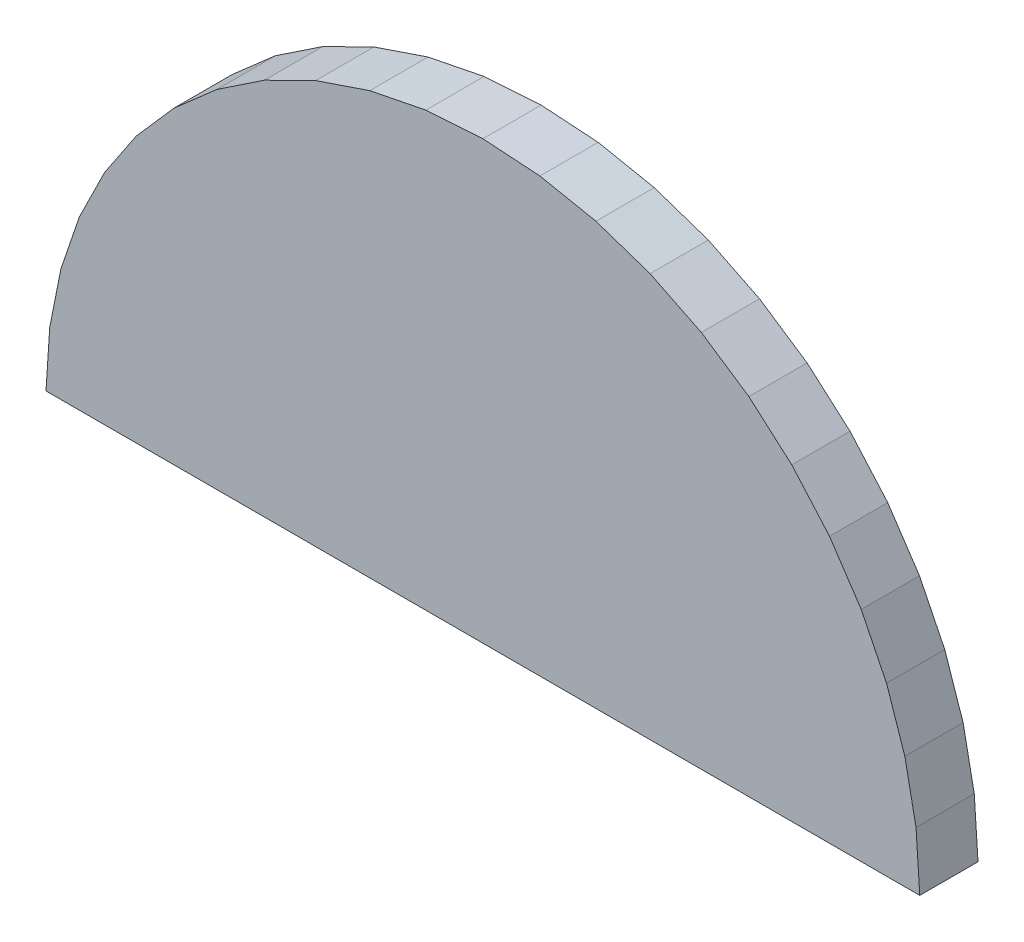
ISO-10303-21;
HEADER;
FILE_DESCRIPTION(('STEP AP214'),'2;1');
FILE_NAME('part.step','',(''),(''),'','','');
FILE_SCHEMA(('AUTOMOTIVE_DESIGN { 1 0 10303 214 1 1 1 1 }'));
ENDSEC;
DATA;
#1=APPLICATION_CONTEXT('core data for automotive mechanical design processes');
#2=APPLICATION_PROTOCOL_DEFINITION('international standard','automotive_design',2000,#1);
#3=PRODUCT_CONTEXT('',#1,'mechanical');
#4=PRODUCT('Part','Part','',(#3));
#5=PRODUCT_RELATED_PRODUCT_CATEGORY('part','',(#4));
#6=PRODUCT_DEFINITION_FORMATION('','',#4);
#7=PRODUCT_DEFINITION_CONTEXT('part definition',#1,'design');
#8=PRODUCT_DEFINITION('design','',#6,#7);
#9=PRODUCT_DEFINITION_SHAPE('','',#8);
#10=(LENGTH_UNIT() NAMED_UNIT(*) SI_UNIT(.MILLI.,.METRE.));
#11=(NAMED_UNIT(*) PLANE_ANGLE_UNIT() SI_UNIT($,.RADIAN.));
#12=(NAMED_UNIT(*) SI_UNIT($,.STERADIAN.) SOLID_ANGLE_UNIT());
#13=UNCERTAINTY_MEASURE_WITH_UNIT(LENGTH_MEASURE(1.E-05),#10,'distance_accuracy_value','');
#14=(GEOMETRIC_REPRESENTATION_CONTEXT(3) GLOBAL_UNCERTAINTY_ASSIGNED_CONTEXT((#13)) GLOBAL_UNIT_ASSIGNED_CONTEXT((#10,
#11,#12)) REPRESENTATION_CONTEXT('',''));
#15=CARTESIAN_POINT('',(0.,0.,0.));
#16=DIRECTION('',(0.,0.,1.));
#17=DIRECTION('',(1.,0.,0.));
#18=AXIS2_PLACEMENT_3D('',#15,#16,#17);
#19=CARTESIAN_POINT('',(-90.,0.,12.));
#20=DIRECTION('',(0.,1.,0.));
#21=DIRECTION('',(-1.,0.,0.));
#22=AXIS2_PLACEMENT_3D('',#19,#20,#21);
#23=PLANE('',#22);
#24=DIRECTION('',(1.,0.,0.));
#25=VECTOR('',#24,1.);
#26=CARTESIAN_POINT('',(-90.,0.,0.));
#27=LINE('',#26,#25);
#28=CARTESIAN_POINT('',(-90.,0.,0.));
#29=VERTEX_POINT('',#28);
#30=CARTESIAN_POINT('',(90.,0.,0.));
#31=VERTEX_POINT('',#30);
#32=EDGE_CURVE('E237',#29,#31,#27,.T.);
#33=ORIENTED_EDGE('',*,*,#32,.T.);
#34=DIRECTION('',(0.,0.,-1.));
#35=VECTOR('',#34,1.);
#36=CARTESIAN_POINT('',(90.,0.,12.));
#37=LINE('',#36,#35);
#38=CARTESIAN_POINT('',(90.,0.,12.));
#39=VERTEX_POINT('',#38);
#40=EDGE_CURVE('E11',#39,#31,#37,.T.);
#41=ORIENTED_EDGE('',*,*,#40,.F.);
#42=DIRECTION('',(1.,0.,0.));
#43=VECTOR('',#42,1.);
#44=CARTESIAN_POINT('',(-90.,0.,12.));
#45=LINE('',#44,#43);
#46=CARTESIAN_POINT('',(-90.,0.,12.));
#47=VERTEX_POINT('',#46);
#48=EDGE_CURVE('E285',#47,#39,#45,.T.);
#49=ORIENTED_EDGE('',*,*,#48,.F.);
#50=DIRECTION('',(0.,0.,-1.));
#51=VECTOR('',#50,1.);
#52=CARTESIAN_POINT('',(-90.,0.,12.));
#53=LINE('',#52,#51);
#54=EDGE_CURVE('E233',#47,#29,#53,.T.);
#55=ORIENTED_EDGE('',*,*,#54,.T.);
#56=EDGE_LOOP('',(#33,#41,#49,#55));
#57=FACE_BOUND('',#56,.T.);
#58=ADVANCED_FACE('F39',(#57),#23,.F.);
#59=CARTESIAN_POINT('',(90.,0.,12.));
#60=DIRECTION('',(-0.997858923238603,-0.0654031292301432,0.));
#61=DIRECTION('',(0.0654031292301432,-0.997858923238604,0.));
#62=AXIS2_PLACEMENT_3D('',#59,#60,#61);
#63=PLANE('',#62);
#64=DIRECTION('',(-0.0654031292301432,0.997858923238603,0.));
#65=VECTOR('',#64,1.);
#66=CARTESIAN_POINT('',(90.,0.,0.));
#67=LINE('',#66,#65);
#68=CARTESIAN_POINT('',(89.2300375236429,11.7473572998046,0.));
#69=VERTEX_POINT('',#68);
#70=EDGE_CURVE('E240',#31,#69,#67,.T.);
#71=ORIENTED_EDGE('',*,*,#70,.T.);
#72=DIRECTION('',(0.,0.,-1.));
#73=VECTOR('',#72,1.);
#74=CARTESIAN_POINT('',(89.2300375236429,11.7473572998046,12.));
#75=LINE('',#74,#73);
#76=CARTESIAN_POINT('',(89.2300375236429,11.7473572998046,12.));
#77=VERTEX_POINT('',#76);
#78=EDGE_CURVE('E47',#77,#69,#75,.T.);
#79=ORIENTED_EDGE('',*,*,#78,.F.);
#80=DIRECTION('',(-0.0654031292301432,0.997858923238603,0.));
#81=VECTOR('',#80,1.);
#82=CARTESIAN_POINT('',(90.,0.,12.));
#83=LINE('',#82,#81);
#84=EDGE_CURVE('E149',#39,#77,#83,.T.);
#85=ORIENTED_EDGE('',*,*,#84,.F.);
#86=ORIENTED_EDGE('',*,*,#40,.T.);
#87=EDGE_LOOP('',(#71,#79,#85,#86));
#88=FACE_BOUND('',#87,.T.);
#89=ADVANCED_FACE('F428',(#88),#63,.F.);
#90=CARTESIAN_POINT('',(89.2300375236429,11.7473572998046,12.));
#91=DIRECTION('',(-0.980785280403231,-0.195090322016127,0.));
#92=DIRECTION('',(0.195090322016127,-0.980785280403231,0.));
#93=AXIS2_PLACEMENT_3D('',#90,#91,#92);
#94=PLANE('',#93);
#95=DIRECTION('',(-0.195090322016127,0.980785280403231,0.));
#96=VECTOR('',#95,1.);
#97=CARTESIAN_POINT('',(89.2300375236429,11.7473572998046,0.));
#98=LINE('',#97,#96);
#99=CARTESIAN_POINT('',(86.9333243660162,23.2937140592269,0.));
#100=VERTEX_POINT('',#99);
#101=EDGE_CURVE('E242',#69,#100,#98,.T.);
#102=ORIENTED_EDGE('',*,*,#101,.T.);
#103=DIRECTION('',(0.,0.,-1.));
#104=VECTOR('',#103,1.);
#105=CARTESIAN_POINT('',(86.9333243660162,23.2937140592269,12.));
#106=LINE('',#105,#104);
#107=CARTESIAN_POINT('',(86.9333243660162,23.2937140592269,12.));
#108=VERTEX_POINT('',#107);
#109=EDGE_CURVE('E343',#108,#100,#106,.T.);
#110=ORIENTED_EDGE('',*,*,#109,.F.);
#111=DIRECTION('',(-0.195090322016127,0.980785280403231,0.));
#112=VECTOR('',#111,1.);
#113=CARTESIAN_POINT('',(89.2300375236429,11.7473572998046,12.));
#114=LINE('',#113,#112);
#115=EDGE_CURVE('E351',#77,#108,#114,.T.);
#116=ORIENTED_EDGE('',*,*,#115,.F.);
#117=ORIENTED_EDGE('',*,*,#78,.T.);
#118=EDGE_LOOP('',(#102,#110,#116,#117));
#119=FACE_BOUND('',#118,.T.);
#120=ADVANCED_FACE('F349',(#119),#94,.F.);
#121=CARTESIAN_POINT('',(86.9333243660162,23.2937140592269,12.));
#122=DIRECTION('',(-0.946930129495105,-0.321439465303162,0.));
#123=DIRECTION('',(0.321439465303162,-0.946930129495105,0.));
#124=AXIS2_PLACEMENT_3D('',#121,#122,#123);
#125=PLANE('',#124);
#126=DIRECTION('',(-0.321439465303162,0.946930129495105,0.));
#127=VECTOR('',#126,1.);
#128=CARTESIAN_POINT('',(86.9333243660162,23.2937140592269,0.));
#129=LINE('',#128,#127);
#130=CARTESIAN_POINT('',(83.1491579260158,34.4415089128581,0.));
#131=VERTEX_POINT('',#130);
#132=EDGE_CURVE('E244',#100,#131,#129,.T.);
#133=ORIENTED_EDGE('',*,*,#132,.T.);
#134=DIRECTION('',(0.,0.,-1.));
#135=VECTOR('',#134,1.);
#136=CARTESIAN_POINT('',(83.1491579260158,34.4415089128581,12.));
#137=LINE('',#136,#135);
#138=CARTESIAN_POINT('',(83.1491579260158,34.4415089128581,12.));
#139=VERTEX_POINT('',#138);
#140=EDGE_CURVE('E340',#139,#131,#137,.T.);
#141=ORIENTED_EDGE('',*,*,#140,.F.);
#142=DIRECTION('',(-0.321439465303162,0.946930129495105,0.));
#143=VECTOR('',#142,1.);
#144=CARTESIAN_POINT('',(86.9333243660162,23.2937140592269,12.));
#145=LINE('',#144,#143);
#146=EDGE_CURVE('E369',#108,#139,#145,.T.);
#147=ORIENTED_EDGE('',*,*,#146,.F.);
#148=ORIENTED_EDGE('',*,*,#109,.T.);
#149=EDGE_LOOP('',(#133,#141,#147,#148));
#150=FACE_BOUND('',#149,.T.);
#151=ADVANCED_FACE('F360',(#150),#125,.F.);
#152=CARTESIAN_POINT('',(83.1491579260158,34.4415089128581,12.));
#153=DIRECTION('',(-0.896872741532688,-0.442288690219002,0.));
#154=DIRECTION('',(0.442288690219002,-0.896872741532688,0.));
#155=AXIS2_PLACEMENT_3D('',#152,#153,#154);
#156=PLANE('',#155);
#157=DIRECTION('',(-0.442288690219002,0.896872741532688,0.));
#158=VECTOR('',#157,1.);
#159=CARTESIAN_POINT('',(83.1491579260158,34.4415089128581,0.));
#160=LINE('',#159,#158);
#161=CARTESIAN_POINT('',(77.9422863405995,45.,0.));
#162=VERTEX_POINT('',#161);
#163=EDGE_CURVE('E246',#131,#162,#160,.T.);
#164=ORIENTED_EDGE('',*,*,#163,.T.);
#165=DIRECTION('',(0.,0.,-1.));
#166=VECTOR('',#165,1.);
#167=CARTESIAN_POINT('',(77.9422863405995,45.,12.));
#168=LINE('',#167,#166);
#169=CARTESIAN_POINT('',(77.9422863405995,45.,12.));
#170=VERTEX_POINT('',#169);
#171=EDGE_CURVE('E337',#170,#162,#168,.T.);
#172=ORIENTED_EDGE('',*,*,#171,.F.);
#173=DIRECTION('',(-0.442288690219002,0.896872741532688,0.));
#174=VECTOR('',#173,1.);
#175=CARTESIAN_POINT('',(83.1491579260158,34.4415089128581,12.));
#176=LINE('',#175,#174);
#177=EDGE_CURVE('E366',#139,#170,#176,.T.);
#178=ORIENTED_EDGE('',*,*,#177,.F.);
#179=ORIENTED_EDGE('',*,*,#140,.T.);
#180=EDGE_LOOP('',(#164,#172,#178,#179));
#181=FACE_BOUND('',#180,.T.);
#182=ADVANCED_FACE('F364',(#181),#156,.F.);
#183=CARTESIAN_POINT('',(77.9422863405995,45.,12.));
#184=DIRECTION('',(-0.831469612302545,-0.555570233019602,0.));
#185=DIRECTION('',(0.555570233019602,-0.831469612302545,0.));
#186=AXIS2_PLACEMENT_3D('',#183,#184,#185);
#187=PLANE('',#186);
#188=DIRECTION('',(-0.555570233019602,0.831469612302545,0.));
#189=VECTOR('',#188,1.);
#190=CARTESIAN_POINT('',(77.9422863405995,45.,0.));
#191=LINE('',#190,#189);
#192=CARTESIAN_POINT('',(71.4018006262112,54.7885286107849,0.));
#193=VERTEX_POINT('',#192);
#194=EDGE_CURVE('E248',#162,#193,#191,.T.);
#195=ORIENTED_EDGE('',*,*,#194,.T.);
#196=DIRECTION('',(0.,0.,-1.));
#197=VECTOR('',#196,1.);
#198=CARTESIAN_POINT('',(71.4018006262112,54.7885286107849,12.));
#199=LINE('',#198,#197);
#200=CARTESIAN_POINT('',(71.4018006262112,54.7885286107849,12.));
#201=VERTEX_POINT('',#200);
#202=EDGE_CURVE('E334',#201,#193,#199,.T.);
#203=ORIENTED_EDGE('',*,*,#202,.F.);
#204=DIRECTION('',(-0.555570233019602,0.831469612302545,0.));
#205=VECTOR('',#204,1.);
#206=CARTESIAN_POINT('',(77.9422863405995,45.,12.));
#207=LINE('',#206,#205);
#208=EDGE_CURVE('E368',#170,#201,#207,.T.);
#209=ORIENTED_EDGE('',*,*,#208,.F.);
#210=ORIENTED_EDGE('',*,*,#171,.T.);
#211=EDGE_LOOP('',(#195,#203,#209,#210));
#212=FACE_BOUND('',#211,.T.);
#213=ADVANCED_FACE('F441',(#212),#187,.F.);
#214=CARTESIAN_POINT('',(71.4018006262112,54.7885286107849,12.));
#215=DIRECTION('',(-0.751839807478977,-0.659345815100069,0.));
#216=DIRECTION('',(0.659345815100069,-0.751839807478977,0.));
#217=AXIS2_PLACEMENT_3D('',#214,#215,#216);
#218=PLANE('',#217);
#219=DIRECTION('',(-0.659345815100069,0.751839807478977,0.));
#220=VECTOR('',#219,1.);
#221=CARTESIAN_POINT('',(71.4018006262112,54.7885286107849,0.));
#222=LINE('',#221,#220);
#223=CARTESIAN_POINT('',(63.6396103067893,63.6396103067893,0.));
#224=VERTEX_POINT('',#223);
#225=EDGE_CURVE('E250',#193,#224,#222,.T.);
#226=ORIENTED_EDGE('',*,*,#225,.T.);
#227=DIRECTION('',(0.,0.,-1.));
#228=VECTOR('',#227,1.);
#229=CARTESIAN_POINT('',(63.6396103067893,63.6396103067893,12.));
#230=LINE('',#229,#228);
#231=CARTESIAN_POINT('',(63.6396103067893,63.6396103067893,12.));
#232=VERTEX_POINT('',#231);
#233=EDGE_CURVE('E331',#232,#224,#230,.T.);
#234=ORIENTED_EDGE('',*,*,#233,.F.);
#235=DIRECTION('',(-0.659345815100069,0.751839807478977,0.));
#236=VECTOR('',#235,1.);
#237=CARTESIAN_POINT('',(71.4018006262112,54.7885286107849,12.));
#238=LINE('',#237,#236);
#239=EDGE_CURVE('E371',#201,#232,#238,.T.);
#240=ORIENTED_EDGE('',*,*,#239,.F.);
#241=ORIENTED_EDGE('',*,*,#202,.T.);
#242=EDGE_LOOP('',(#226,#234,#240,#241));
#243=FACE_BOUND('',#242,.T.);
#244=ADVANCED_FACE('F444',(#243),#218,.F.);
#245=CARTESIAN_POINT('',(63.6396103067893,63.6396103067893,12.));
#246=DIRECTION('',(-0.659345815100069,-0.751839807478977,0.));
#247=DIRECTION('',(0.751839807478977,-0.659345815100069,0.));
#248=AXIS2_PLACEMENT_3D('',#245,#246,#247);
#249=PLANE('',#248);
#250=DIRECTION('',(-0.751839807478977,0.659345815100069,0.));
#251=VECTOR('',#250,1.);
#252=CARTESIAN_POINT('',(63.6396103067893,63.6396103067893,0.));
#253=LINE('',#252,#251);
#254=CARTESIAN_POINT('',(54.7885286107849,71.4018006262112,0.));
#255=VERTEX_POINT('',#254);
#256=EDGE_CURVE('E252',#224,#255,#253,.T.);
#257=ORIENTED_EDGE('',*,*,#256,.T.);
#258=DIRECTION('',(0.,0.,-1.));
#259=VECTOR('',#258,1.);
#260=CARTESIAN_POINT('',(54.7885286107849,71.4018006262112,12.));
#261=LINE('',#260,#259);
#262=CARTESIAN_POINT('',(54.7885286107849,71.4018006262112,12.));
#263=VERTEX_POINT('',#262);
#264=EDGE_CURVE('E328',#263,#255,#261,.T.);
#265=ORIENTED_EDGE('',*,*,#264,.F.);
#266=DIRECTION('',(-0.751839807478977,0.659345815100069,0.));
#267=VECTOR('',#266,1.);
#268=CARTESIAN_POINT('',(63.6396103067893,63.6396103067893,12.));
#269=LINE('',#268,#267);
#270=EDGE_CURVE('E377',#232,#263,#269,.T.);
#271=ORIENTED_EDGE('',*,*,#270,.F.);
#272=ORIENTED_EDGE('',*,*,#233,.T.);
#273=EDGE_LOOP('',(#257,#265,#271,#272));
#274=FACE_BOUND('',#273,.T.);
#275=ADVANCED_FACE('F448',(#274),#249,.F.);
#276=CARTESIAN_POINT('',(54.7885286107849,71.4018006262112,12.));
#277=DIRECTION('',(-0.555570233019603,-0.831469612302545,0.));
#278=DIRECTION('',(0.831469612302545,-0.555570233019603,0.));
#279=AXIS2_PLACEMENT_3D('',#276,#277,#278);
#280=PLANE('',#279);
#281=DIRECTION('',(-0.831469612302545,0.555570233019602,0.));
#282=VECTOR('',#281,1.);
#283=CARTESIAN_POINT('',(54.7885286107849,71.4018006262112,0.));
#284=LINE('',#283,#282);
#285=CARTESIAN_POINT('',(45.,77.9422863405995,0.));
#286=VERTEX_POINT('',#285);
#287=EDGE_CURVE('E254',#255,#286,#284,.T.);
#288=ORIENTED_EDGE('',*,*,#287,.T.);
#289=DIRECTION('',(0.,0.,-1.));
#290=VECTOR('',#289,1.);
#291=CARTESIAN_POINT('',(45.,77.9422863405995,12.));
#292=LINE('',#291,#290);
#293=CARTESIAN_POINT('',(45.,77.9422863405995,12.));
#294=VERTEX_POINT('',#293);
#295=EDGE_CURVE('E325',#294,#286,#292,.T.);
#296=ORIENTED_EDGE('',*,*,#295,.F.);
#297=DIRECTION('',(-0.831469612302545,0.555570233019602,0.));
#298=VECTOR('',#297,1.);
#299=CARTESIAN_POINT('',(54.7885286107849,71.4018006262112,12.));
#300=LINE('',#299,#298);
#301=EDGE_CURVE('E379',#263,#294,#300,.T.);
#302=ORIENTED_EDGE('',*,*,#301,.F.);
#303=ORIENTED_EDGE('',*,*,#264,.T.);
#304=EDGE_LOOP('',(#288,#296,#302,#303));
#305=FACE_BOUND('',#304,.T.);
#306=ADVANCED_FACE('F452',(#305),#280,.F.);
#307=CARTESIAN_POINT('',(45.,77.9422863405995,12.));
#308=DIRECTION('',(-0.442288690219001,-0.896872741532688,0.));
#309=DIRECTION('',(0.896872741532688,-0.442288690219001,0.));
#310=AXIS2_PLACEMENT_3D('',#307,#308,#309);
#311=PLANE('',#310);
#312=DIRECTION('',(-0.896872741532688,0.442288690219001,0.));
#313=VECTOR('',#312,1.);
#314=CARTESIAN_POINT('',(45.,77.9422863405995,0.));
#315=LINE('',#314,#313);
#316=CARTESIAN_POINT('',(34.4415089128581,83.1491579260158,0.));
#317=VERTEX_POINT('',#316);
#318=EDGE_CURVE('E256',#286,#317,#315,.T.);
#319=ORIENTED_EDGE('',*,*,#318,.T.);
#320=DIRECTION('',(0.,0.,-1.));
#321=VECTOR('',#320,1.);
#322=CARTESIAN_POINT('',(34.4415089128581,83.1491579260158,12.));
#323=LINE('',#322,#321);
#324=CARTESIAN_POINT('',(34.4415089128581,83.1491579260158,12.));
#325=VERTEX_POINT('',#324);
#326=EDGE_CURVE('E322',#325,#317,#323,.T.);
#327=ORIENTED_EDGE('',*,*,#326,.F.);
#328=DIRECTION('',(-0.896872741532688,0.442288690219001,0.));
#329=VECTOR('',#328,1.);
#330=CARTESIAN_POINT('',(45.,77.9422863405995,12.));
#331=LINE('',#330,#329);
#332=EDGE_CURVE('E381',#294,#325,#331,.T.);
#333=ORIENTED_EDGE('',*,*,#332,.F.);
#334=ORIENTED_EDGE('',*,*,#295,.T.);
#335=EDGE_LOOP('',(#319,#327,#333,#334));
#336=FACE_BOUND('',#335,.T.);
#337=ADVANCED_FACE('F456',(#336),#311,.F.);
#338=CARTESIAN_POINT('',(34.4415089128581,83.1491579260158,12.));
#339=DIRECTION('',(-0.321439465303162,-0.946930129495105,0.));
#340=DIRECTION('',(0.946930129495105,-0.321439465303162,0.));
#341=AXIS2_PLACEMENT_3D('',#338,#339,#340);
#342=PLANE('',#341);
#343=DIRECTION('',(-0.946930129495105,0.321439465303162,0.));
#344=VECTOR('',#343,1.);
#345=CARTESIAN_POINT('',(34.4415089128581,83.1491579260158,0.));
#346=LINE('',#345,#344);
#347=CARTESIAN_POINT('',(23.2937140592269,86.9333243660162,0.));
#348=VERTEX_POINT('',#347);
#349=EDGE_CURVE('E258',#317,#348,#346,.T.);
#350=ORIENTED_EDGE('',*,*,#349,.T.);
#351=DIRECTION('',(0.,0.,-1.));
#352=VECTOR('',#351,1.);
#353=CARTESIAN_POINT('',(23.2937140592269,86.9333243660162,12.));
#354=LINE('',#353,#352);
#355=CARTESIAN_POINT('',(23.2937140592269,86.9333243660162,12.));
#356=VERTEX_POINT('',#355);
#357=EDGE_CURVE('E319',#356,#348,#354,.T.);
#358=ORIENTED_EDGE('',*,*,#357,.F.);
#359=DIRECTION('',(-0.946930129495105,0.321439465303162,0.));
#360=VECTOR('',#359,1.);
#361=CARTESIAN_POINT('',(34.4415089128581,83.1491579260158,12.));
#362=LINE('',#361,#360);
#363=EDGE_CURVE('E383',#325,#356,#362,.T.);
#364=ORIENTED_EDGE('',*,*,#363,.F.);
#365=ORIENTED_EDGE('',*,*,#326,.T.);
#366=EDGE_LOOP('',(#350,#358,#364,#365));
#367=FACE_BOUND('',#366,.T.);
#368=ADVANCED_FACE('F460',(#367),#342,.F.);
#369=CARTESIAN_POINT('',(23.2937140592269,86.9333243660162,12.));
#370=DIRECTION('',(-0.195090322016128,-0.980785280403231,0.));
#371=DIRECTION('',(0.980785280403231,-0.195090322016128,0.));
#372=AXIS2_PLACEMENT_3D('',#369,#370,#371);
#373=PLANE('',#372);
#374=DIRECTION('',(-0.980785280403231,0.195090322016127,0.));
#375=VECTOR('',#374,1.);
#376=CARTESIAN_POINT('',(23.2937140592269,86.9333243660162,0.));
#377=LINE('',#376,#375);
#378=CARTESIAN_POINT('',(11.7473572998047,89.2300375236429,0.));
#379=VERTEX_POINT('',#378);
#380=EDGE_CURVE('E260',#348,#379,#377,.T.);
#381=ORIENTED_EDGE('',*,*,#380,.T.);
#382=DIRECTION('',(0.,0.,-1.));
#383=VECTOR('',#382,1.);
#384=CARTESIAN_POINT('',(11.7473572998047,89.2300375236429,12.));
#385=LINE('',#384,#383);
#386=CARTESIAN_POINT('',(11.7473572998047,89.2300375236429,12.));
#387=VERTEX_POINT('',#386);
#388=EDGE_CURVE('E316',#387,#379,#385,.T.);
#389=ORIENTED_EDGE('',*,*,#388,.F.);
#390=DIRECTION('',(-0.980785280403231,0.195090322016127,0.));
#391=VECTOR('',#390,1.);
#392=CARTESIAN_POINT('',(23.2937140592269,86.9333243660162,12.));
#393=LINE('',#392,#391);
#394=EDGE_CURVE('E385',#356,#387,#393,.T.);
#395=ORIENTED_EDGE('',*,*,#394,.F.);
#396=ORIENTED_EDGE('',*,*,#357,.T.);
#397=EDGE_LOOP('',(#381,#389,#395,#396));
#398=FACE_BOUND('',#397,.T.);
#399=ADVANCED_FACE('F464',(#398),#373,.F.);
#400=CARTESIAN_POINT('',(11.7473572998047,89.2300375236429,12.));
#401=DIRECTION('',(-0.0654031292301431,-0.997858923238603,0.));
#402=DIRECTION('',(0.997858923238604,-0.0654031292301431,0.));
#403=AXIS2_PLACEMENT_3D('',#400,#401,#402);
#404=PLANE('',#403);
#405=DIRECTION('',(-0.997858923238603,0.0654031292301431,0.));
#406=VECTOR('',#405,1.);
#407=CARTESIAN_POINT('',(11.7473572998047,89.2300375236429,0.));
#408=LINE('',#407,#406);
#409=CARTESIAN_POINT('',(0.,90.,0.));
#410=VERTEX_POINT('',#409);
#411=EDGE_CURVE('E262',#379,#410,#408,.T.);
#412=ORIENTED_EDGE('',*,*,#411,.T.);
#413=DIRECTION('',(0.,0.,-1.));
#414=VECTOR('',#413,1.);
#415=CARTESIAN_POINT('',(0.,90.,12.));
#416=LINE('',#415,#414);
#417=CARTESIAN_POINT('',(0.,90.,12.));
#418=VERTEX_POINT('',#417);
#419=EDGE_CURVE('E313',#418,#410,#416,.T.);
#420=ORIENTED_EDGE('',*,*,#419,.F.);
#421=DIRECTION('',(-0.997858923238603,0.0654031292301431,0.));
#422=VECTOR('',#421,1.);
#423=CARTESIAN_POINT('',(11.7473572998047,89.2300375236429,12.));
#424=LINE('',#423,#422);
#425=EDGE_CURVE('E387',#387,#418,#424,.T.);
#426=ORIENTED_EDGE('',*,*,#425,.F.);
#427=ORIENTED_EDGE('',*,*,#388,.T.);
#428=EDGE_LOOP('',(#412,#420,#426,#427));
#429=FACE_BOUND('',#428,.T.);
#430=ADVANCED_FACE('F468',(#429),#404,.F.);
#431=CARTESIAN_POINT('',(0.,90.,12.));
#432=DIRECTION('',(0.0654031292301431,-0.997858923238603,0.));
#433=DIRECTION('',(0.997858923238604,0.0654031292301431,0.));
#434=AXIS2_PLACEMENT_3D('',#431,#432,#433);
#435=PLANE('',#434);
#436=DIRECTION('',(-0.997858923238603,-0.0654031292301431,0.));
#437=VECTOR('',#436,1.);
#438=CARTESIAN_POINT('',(0.,90.,0.));
#439=LINE('',#438,#437);
#440=CARTESIAN_POINT('',(-11.7473572998046,89.2300375236429,0.));
#441=VERTEX_POINT('',#440);
#442=EDGE_CURVE('E264',#410,#441,#439,.T.);
#443=ORIENTED_EDGE('',*,*,#442,.T.);
#444=DIRECTION('',(0.,0.,-1.));
#445=VECTOR('',#444,1.);
#446=CARTESIAN_POINT('',(-11.7473572998046,89.2300375236429,12.));
#447=LINE('',#446,#445);
#448=CARTESIAN_POINT('',(-11.7473572998046,89.2300375236429,12.));
#449=VERTEX_POINT('',#448);
#450=EDGE_CURVE('E310',#449,#441,#447,.T.);
#451=ORIENTED_EDGE('',*,*,#450,.F.);
#452=DIRECTION('',(-0.997858923238603,-0.0654031292301431,0.));
#453=VECTOR('',#452,1.);
#454=CARTESIAN_POINT('',(0.,90.,12.));
#455=LINE('',#454,#453);
#456=EDGE_CURVE('E389',#418,#449,#455,.T.);
#457=ORIENTED_EDGE('',*,*,#456,.F.);
#458=ORIENTED_EDGE('',*,*,#419,.T.);
#459=EDGE_LOOP('',(#443,#451,#457,#458));
#460=FACE_BOUND('',#459,.T.);
#461=ADVANCED_FACE('F472',(#460),#435,.F.);
#462=CARTESIAN_POINT('',(-11.7473572998046,89.2300375236429,12.));
#463=DIRECTION('',(0.195090322016127,-0.980785280403231,0.));
#464=DIRECTION('',(0.980785280403231,0.195090322016127,0.));
#465=AXIS2_PLACEMENT_3D('',#462,#463,#464);
#466=PLANE('',#465);
#467=DIRECTION('',(-0.980785280403231,-0.195090322016127,0.));
#468=VECTOR('',#467,1.);
#469=CARTESIAN_POINT('',(-11.7473572998046,89.2300375236429,0.));
#470=LINE('',#469,#468);
#471=CARTESIAN_POINT('',(-23.2937140592269,86.9333243660162,0.));
#472=VERTEX_POINT('',#471);
#473=EDGE_CURVE('E266',#441,#472,#470,.T.);
#474=ORIENTED_EDGE('',*,*,#473,.T.);
#475=DIRECTION('',(0.,0.,-1.));
#476=VECTOR('',#475,1.);
#477=CARTESIAN_POINT('',(-23.2937140592269,86.9333243660162,12.));
#478=LINE('',#477,#476);
#479=CARTESIAN_POINT('',(-23.2937140592269,86.9333243660162,12.));
#480=VERTEX_POINT('',#479);
#481=EDGE_CURVE('E307',#480,#472,#478,.T.);
#482=ORIENTED_EDGE('',*,*,#481,.F.);
#483=DIRECTION('',(-0.980785280403231,-0.195090322016127,0.));
#484=VECTOR('',#483,1.);
#485=CARTESIAN_POINT('',(-11.7473572998046,89.2300375236429,12.));
#486=LINE('',#485,#484);
#487=EDGE_CURVE('E391',#449,#480,#486,.T.);
#488=ORIENTED_EDGE('',*,*,#487,.F.);
#489=ORIENTED_EDGE('',*,*,#450,.T.);
#490=EDGE_LOOP('',(#474,#482,#488,#489));
#491=FACE_BOUND('',#490,.T.);
#492=ADVANCED_FACE('F476',(#491),#466,.F.);
#493=CARTESIAN_POINT('',(-23.2937140592269,86.9333243660162,12.));
#494=DIRECTION('',(0.321439465303162,-0.946930129495106,0.));
#495=DIRECTION('',(0.946930129495106,0.321439465303162,0.));
#496=AXIS2_PLACEMENT_3D('',#493,#494,#495);
#497=PLANE('',#496);
#498=DIRECTION('',(-0.946930129495106,-0.321439465303162,0.));
#499=VECTOR('',#498,1.);
#500=CARTESIAN_POINT('',(-23.2937140592269,86.9333243660162,0.));
#501=LINE('',#500,#499);
#502=CARTESIAN_POINT('',(-34.4415089128581,83.1491579260158,0.));
#503=VERTEX_POINT('',#502);
#504=EDGE_CURVE('E268',#472,#503,#501,.T.);
#505=ORIENTED_EDGE('',*,*,#504,.T.);
#506=DIRECTION('',(0.,0.,-1.));
#507=VECTOR('',#506,1.);
#508=CARTESIAN_POINT('',(-34.4415089128581,83.1491579260158,12.));
#509=LINE('',#508,#507);
#510=CARTESIAN_POINT('',(-34.4415089128581,83.1491579260158,12.));
#511=VERTEX_POINT('',#510);
#512=EDGE_CURVE('E304',#511,#503,#509,.T.);
#513=ORIENTED_EDGE('',*,*,#512,.F.);
#514=DIRECTION('',(-0.946930129495106,-0.321439465303162,0.));
#515=VECTOR('',#514,1.);
#516=CARTESIAN_POINT('',(-23.2937140592269,86.9333243660162,12.));
#517=LINE('',#516,#515);
#518=EDGE_CURVE('E393',#480,#511,#517,.T.);
#519=ORIENTED_EDGE('',*,*,#518,.F.);
#520=ORIENTED_EDGE('',*,*,#481,.T.);
#521=EDGE_LOOP('',(#505,#513,#519,#520));
#522=FACE_BOUND('',#521,.T.);
#523=ADVANCED_FACE('F480',(#522),#497,.F.);
#524=CARTESIAN_POINT('',(-34.4415089128581,83.1491579260158,12.));
#525=DIRECTION('',(0.442288690219002,-0.896872741532688,0.));
#526=DIRECTION('',(0.896872741532688,0.442288690219002,0.));
#527=AXIS2_PLACEMENT_3D('',#524,#525,#526);
#528=PLANE('',#527);
#529=DIRECTION('',(-0.896872741532688,-0.442288690219002,0.));
#530=VECTOR('',#529,1.);
#531=CARTESIAN_POINT('',(-34.4415089128581,83.1491579260158,0.));
#532=LINE('',#531,#530);
#533=CARTESIAN_POINT('',(-45.,77.9422863405995,0.));
#534=VERTEX_POINT('',#533);
#535=EDGE_CURVE('E270',#503,#534,#532,.T.);
#536=ORIENTED_EDGE('',*,*,#535,.T.);
#537=DIRECTION('',(0.,0.,-1.));
#538=VECTOR('',#537,1.);
#539=CARTESIAN_POINT('',(-45.,77.9422863405995,12.));
#540=LINE('',#539,#538);
#541=CARTESIAN_POINT('',(-45.,77.9422863405995,12.));
#542=VERTEX_POINT('',#541);
#543=EDGE_CURVE('E301',#542,#534,#540,.T.);
#544=ORIENTED_EDGE('',*,*,#543,.F.);
#545=DIRECTION('',(-0.896872741532688,-0.442288690219002,0.));
#546=VECTOR('',#545,1.);
#547=CARTESIAN_POINT('',(-34.4415089128581,83.1491579260158,12.));
#548=LINE('',#547,#546);
#549=EDGE_CURVE('E395',#511,#542,#548,.T.);
#550=ORIENTED_EDGE('',*,*,#549,.F.);
#551=ORIENTED_EDGE('',*,*,#512,.T.);
#552=EDGE_LOOP('',(#536,#544,#550,#551));
#553=FACE_BOUND('',#552,.T.);
#554=ADVANCED_FACE('F484',(#553),#528,.F.);
#555=CARTESIAN_POINT('',(-45.,77.9422863405995,12.));
#556=DIRECTION('',(0.555570233019601,-0.831469612302546,0.));
#557=DIRECTION('',(0.831469612302546,0.555570233019601,0.));
#558=AXIS2_PLACEMENT_3D('',#555,#556,#557);
#559=PLANE('',#558);
#560=DIRECTION('',(-0.831469612302546,-0.555570233019601,0.));
#561=VECTOR('',#560,1.);
#562=CARTESIAN_POINT('',(-45.,77.9422863405995,0.));
#563=LINE('',#562,#561);
#564=CARTESIAN_POINT('',(-54.7885286107849,71.4018006262112,0.));
#565=VERTEX_POINT('',#564);
#566=EDGE_CURVE('E272',#534,#565,#563,.T.);
#567=ORIENTED_EDGE('',*,*,#566,.T.);
#568=DIRECTION('',(0.,0.,-1.));
#569=VECTOR('',#568,1.);
#570=CARTESIAN_POINT('',(-54.7885286107849,71.4018006262112,12.));
#571=LINE('',#570,#569);
#572=CARTESIAN_POINT('',(-54.7885286107849,71.4018006262112,12.));
#573=VERTEX_POINT('',#572);
#574=EDGE_CURVE('E298',#573,#565,#571,.T.);
#575=ORIENTED_EDGE('',*,*,#574,.F.);
#576=DIRECTION('',(-0.831469612302546,-0.555570233019601,0.));
#577=VECTOR('',#576,1.);
#578=CARTESIAN_POINT('',(-45.,77.9422863405995,12.));
#579=LINE('',#578,#577);
#580=EDGE_CURVE('E397',#542,#573,#579,.T.);
#581=ORIENTED_EDGE('',*,*,#580,.F.);
#582=ORIENTED_EDGE('',*,*,#543,.T.);
#583=EDGE_LOOP('',(#567,#575,#581,#582));
#584=FACE_BOUND('',#583,.T.);
#585=ADVANCED_FACE('F488',(#584),#559,.F.);
#586=CARTESIAN_POINT('',(-54.7885286107849,71.4018006262112,12.));
#587=DIRECTION('',(0.659345815100069,-0.751839807478977,0.));
#588=DIRECTION('',(0.751839807478977,0.659345815100069,0.));
#589=AXIS2_PLACEMENT_3D('',#586,#587,#588);
#590=PLANE('',#589);
#591=DIRECTION('',(-0.751839807478977,-0.659345815100069,0.));
#592=VECTOR('',#591,1.);
#593=CARTESIAN_POINT('',(-54.7885286107849,71.4018006262112,0.));
#594=LINE('',#593,#592);
#595=CARTESIAN_POINT('',(-63.6396103067893,63.6396103067893,0.));
#596=VERTEX_POINT('',#595);
#597=EDGE_CURVE('E274',#565,#596,#594,.T.);
#598=ORIENTED_EDGE('',*,*,#597,.T.);
#599=DIRECTION('',(0.,0.,-1.));
#600=VECTOR('',#599,1.);
#601=CARTESIAN_POINT('',(-63.6396103067893,63.6396103067893,12.));
#602=LINE('',#601,#600);
#603=CARTESIAN_POINT('',(-63.6396103067893,63.6396103067893,12.));
#604=VERTEX_POINT('',#603);
#605=EDGE_CURVE('E295',#604,#596,#602,.T.);
#606=ORIENTED_EDGE('',*,*,#605,.F.);
#607=DIRECTION('',(-0.751839807478977,-0.659345815100069,0.));
#608=VECTOR('',#607,1.);
#609=CARTESIAN_POINT('',(-54.7885286107849,71.4018006262112,12.));
#610=LINE('',#609,#608);
#611=EDGE_CURVE('E399',#573,#604,#610,.T.);
#612=ORIENTED_EDGE('',*,*,#611,.F.);
#613=ORIENTED_EDGE('',*,*,#574,.T.);
#614=EDGE_LOOP('',(#598,#606,#612,#613));
#615=FACE_BOUND('',#614,.T.);
#616=ADVANCED_FACE('F492',(#615),#590,.F.);
#617=CARTESIAN_POINT('',(-63.6396103067893,63.6396103067893,12.));
#618=DIRECTION('',(0.751839807478977,-0.659345815100069,0.));
#619=DIRECTION('',(0.659345815100069,0.751839807478977,0.));
#620=AXIS2_PLACEMENT_3D('',#617,#618,#619);
#621=PLANE('',#620);
#622=DIRECTION('',(-0.65934581510007,-0.751839807478977,0.));
#623=VECTOR('',#622,1.);
#624=CARTESIAN_POINT('',(-63.6396103067893,63.6396103067893,0.));
#625=LINE('',#624,#623);
#626=CARTESIAN_POINT('',(-71.4018006262112,54.7885286107849,0.));
#627=VERTEX_POINT('',#626);
#628=EDGE_CURVE('E276',#596,#627,#625,.T.);
#629=ORIENTED_EDGE('',*,*,#628,.T.);
#630=DIRECTION('',(0.,0.,-1.));
#631=VECTOR('',#630,1.);
#632=CARTESIAN_POINT('',(-71.4018006262112,54.7885286107849,12.));
#633=LINE('',#632,#631);
#634=CARTESIAN_POINT('',(-71.4018006262112,54.7885286107849,12.));
#635=VERTEX_POINT('',#634);
#636=EDGE_CURVE('E292',#635,#627,#633,.T.);
#637=ORIENTED_EDGE('',*,*,#636,.F.);
#638=DIRECTION('',(-0.65934581510007,-0.751839807478977,0.));
#639=VECTOR('',#638,1.);
#640=CARTESIAN_POINT('',(-63.6396103067893,63.6396103067893,12.));
#641=LINE('',#640,#639);
#642=EDGE_CURVE('E401',#604,#635,#641,.T.);
#643=ORIENTED_EDGE('',*,*,#642,.F.);
#644=ORIENTED_EDGE('',*,*,#605,.T.);
#645=EDGE_LOOP('',(#629,#637,#643,#644));
#646=FACE_BOUND('',#645,.T.);
#647=ADVANCED_FACE('F496',(#646),#621,.F.);
#648=CARTESIAN_POINT('',(-71.4018006262112,54.7885286107849,12.));
#649=DIRECTION('',(0.831469612302546,-0.555570233019602,0.));
#650=DIRECTION('',(0.555570233019602,0.831469612302546,0.));
#651=AXIS2_PLACEMENT_3D('',#648,#649,#650);
#652=PLANE('',#651);
#653=DIRECTION('',(-0.555570233019602,-0.831469612302545,0.));
#654=VECTOR('',#653,1.);
#655=CARTESIAN_POINT('',(-71.4018006262112,54.7885286107849,0.));
#656=LINE('',#655,#654);
#657=CARTESIAN_POINT('',(-77.9422863405995,45.,0.));
#658=VERTEX_POINT('',#657);
#659=EDGE_CURVE('E278',#627,#658,#656,.T.);
#660=ORIENTED_EDGE('',*,*,#659,.T.);
#661=DIRECTION('',(0.,0.,-1.));
#662=VECTOR('',#661,1.);
#663=CARTESIAN_POINT('',(-77.9422863405995,45.,12.));
#664=LINE('',#663,#662);
#665=CARTESIAN_POINT('',(-77.9422863405995,45.,12.));
#666=VERTEX_POINT('',#665);
#667=EDGE_CURVE('E289',#666,#658,#664,.T.);
#668=ORIENTED_EDGE('',*,*,#667,.F.);
#669=DIRECTION('',(-0.555570233019602,-0.831469612302545,0.));
#670=VECTOR('',#669,1.);
#671=CARTESIAN_POINT('',(-71.4018006262112,54.7885286107849,12.));
#672=LINE('',#671,#670);
#673=EDGE_CURVE('E403',#635,#666,#672,.T.);
#674=ORIENTED_EDGE('',*,*,#673,.F.);
#675=ORIENTED_EDGE('',*,*,#636,.T.);
#676=EDGE_LOOP('',(#660,#668,#674,#675));
#677=FACE_BOUND('',#676,.T.);
#678=ADVANCED_FACE('F409',(#677),#652,.F.);
#679=CARTESIAN_POINT('',(-77.9422863405995,45.,12.));
#680=DIRECTION('',(0.896872741532688,-0.442288690219002,0.));
#681=DIRECTION('',(0.442288690219002,0.896872741532688,0.));
#682=AXIS2_PLACEMENT_3D('',#679,#680,#681);
#683=PLANE('',#682);
#684=DIRECTION('',(-0.442288690219002,-0.896872741532688,0.));
#685=VECTOR('',#684,1.);
#686=CARTESIAN_POINT('',(-77.9422863405995,45.,0.));
#687=LINE('',#686,#685);
#688=CARTESIAN_POINT('',(-83.1491579260158,34.4415089128581,0.));
#689=VERTEX_POINT('',#688);
#690=EDGE_CURVE('E280',#658,#689,#687,.T.);
#691=ORIENTED_EDGE('',*,*,#690,.T.);
#692=DIRECTION('',(0.,0.,-1.));
#693=VECTOR('',#692,1.);
#694=CARTESIAN_POINT('',(-83.1491579260158,34.4415089128581,12.));
#695=LINE('',#694,#693);
#696=CARTESIAN_POINT('',(-83.1491579260158,34.4415089128581,12.));
#697=VERTEX_POINT('',#696);
#698=EDGE_CURVE('E228',#697,#689,#695,.T.);
#699=ORIENTED_EDGE('',*,*,#698,.F.);
#700=DIRECTION('',(-0.442288690219002,-0.896872741532688,0.));
#701=VECTOR('',#700,1.);
#702=CARTESIAN_POINT('',(-77.9422863405995,45.,12.));
#703=LINE('',#702,#701);
#704=EDGE_CURVE('E219',#666,#697,#703,.T.);
#705=ORIENTED_EDGE('',*,*,#704,.F.);
#706=ORIENTED_EDGE('',*,*,#667,.T.);
#707=EDGE_LOOP('',(#691,#699,#705,#706));
#708=FACE_BOUND('',#707,.T.);
#709=ADVANCED_FACE('F413',(#708),#683,.F.);
#710=CARTESIAN_POINT('',(-83.1491579260158,34.4415089128581,12.));
#711=DIRECTION('',(0.946930129495106,-0.321439465303162,0.));
#712=DIRECTION('',(0.321439465303162,0.946930129495106,0.));
#713=AXIS2_PLACEMENT_3D('',#710,#711,#712);
#714=PLANE('',#713);
#715=DIRECTION('',(-0.321439465303162,-0.946930129495106,0.));
#716=VECTOR('',#715,1.);
#717=CARTESIAN_POINT('',(-83.1491579260158,34.4415089128581,0.));
#718=LINE('',#717,#716);
#719=CARTESIAN_POINT('',(-86.9333243660161,23.2937140592269,0.));
#720=VERTEX_POINT('',#719);
#721=EDGE_CURVE('E227',#689,#720,#718,.T.);
#722=ORIENTED_EDGE('',*,*,#721,.T.);
#723=DIRECTION('',(0.,0.,-1.));
#724=VECTOR('',#723,1.);
#725=CARTESIAN_POINT('',(-86.9333243660161,23.2937140592269,12.));
#726=LINE('',#725,#724);
#727=CARTESIAN_POINT('',(-86.9333243660161,23.2937140592269,12.));
#728=VERTEX_POINT('',#727);
#729=EDGE_CURVE('E224',#728,#720,#726,.T.);
#730=ORIENTED_EDGE('',*,*,#729,.F.);
#731=DIRECTION('',(-0.321439465303162,-0.946930129495106,0.));
#732=VECTOR('',#731,1.);
#733=CARTESIAN_POINT('',(-83.1491579260158,34.4415089128581,12.));
#734=LINE('',#733,#732);
#735=EDGE_CURVE('E213',#697,#728,#734,.T.);
#736=ORIENTED_EDGE('',*,*,#735,.F.);
#737=ORIENTED_EDGE('',*,*,#698,.T.);
#738=EDGE_LOOP('',(#722,#730,#736,#737));
#739=FACE_BOUND('',#738,.T.);
#740=ADVANCED_FACE('F225',(#739),#714,.F.);
#741=CARTESIAN_POINT('',(-86.9333243660161,23.2937140592269,12.));
#742=DIRECTION('',(0.98078528040323,-0.195090322016128,0.));
#743=DIRECTION('',(0.195090322016129,0.980785280403231,0.));
#744=AXIS2_PLACEMENT_3D('',#741,#742,#743);
#745=PLANE('',#744);
#746=DIRECTION('',(-0.195090322016129,-0.98078528040323,0.));
#747=VECTOR('',#746,1.);
#748=CARTESIAN_POINT('',(-86.9333243660161,23.2937140592269,0.));
#749=LINE('',#748,#747);
#750=CARTESIAN_POINT('',(-89.2300375236429,11.7473572998047,0.));
#751=VERTEX_POINT('',#750);
#752=EDGE_CURVE('E135',#720,#751,#749,.T.);
#753=ORIENTED_EDGE('',*,*,#752,.T.);
#754=DIRECTION('',(0.,0.,-1.));
#755=VECTOR('',#754,1.);
#756=CARTESIAN_POINT('',(-89.2300375236429,11.7473572998047,12.));
#757=LINE('',#756,#755);
#758=CARTESIAN_POINT('',(-89.2300375236429,11.7473572998047,12.));
#759=VERTEX_POINT('',#758);
#760=EDGE_CURVE('E229',#759,#751,#757,.T.);
#761=ORIENTED_EDGE('',*,*,#760,.F.);
#762=DIRECTION('',(-0.195090322016129,-0.98078528040323,0.));
#763=VECTOR('',#762,1.);
#764=CARTESIAN_POINT('',(-86.9333243660161,23.2937140592269,12.));
#765=LINE('',#764,#763);
#766=EDGE_CURVE('E217',#728,#759,#765,.T.);
#767=ORIENTED_EDGE('',*,*,#766,.F.);
#768=ORIENTED_EDGE('',*,*,#729,.T.);
#769=EDGE_LOOP('',(#753,#761,#767,#768));
#770=FACE_BOUND('',#769,.T.);
#771=ADVANCED_FACE('F231',(#770),#745,.F.);
#772=CARTESIAN_POINT('',(-89.2300375236429,11.7473572998047,12.));
#773=DIRECTION('',(0.997858923238603,-0.065403129230143,0.));
#774=DIRECTION('',(0.065403129230143,0.997858923238604,0.));
#775=AXIS2_PLACEMENT_3D('',#772,#773,#774);
#776=PLANE('',#775);
#777=DIRECTION('',(-0.065403129230143,-0.997858923238603,0.));
#778=VECTOR('',#777,1.);
#779=CARTESIAN_POINT('',(-89.2300375236429,11.7473572998047,0.));
#780=LINE('',#779,#778);
#781=EDGE_CURVE('E141',#751,#29,#780,.T.);
#782=ORIENTED_EDGE('',*,*,#781,.T.);
#783=ORIENTED_EDGE('',*,*,#54,.F.);
#784=DIRECTION('',(-0.065403129230143,-0.997858923238603,0.));
#785=VECTOR('',#784,1.);
#786=CARTESIAN_POINT('',(-89.2300375236429,11.7473572998047,12.));
#787=LINE('',#786,#785);
#788=EDGE_CURVE('E55',#759,#47,#787,.T.);
#789=ORIENTED_EDGE('',*,*,#788,.F.);
#790=ORIENTED_EDGE('',*,*,#760,.T.);
#791=EDGE_LOOP('',(#782,#783,#789,#790));
#792=FACE_BOUND('',#791,.T.);
#793=ADVANCED_FACE('F417',(#792),#776,.F.);
#794=CARTESIAN_POINT('',(0.,0.,12.));
#795=DIRECTION('',(0.,0.,1.));
#796=DIRECTION('',(1.,0.,0.));
#797=AXIS2_PLACEMENT_3D('',#794,#795,#796);
#798=PLANE('',#797);
#799=ORIENTED_EDGE('',*,*,#48,.T.);
#800=ORIENTED_EDGE('',*,*,#84,.T.);
#801=ORIENTED_EDGE('',*,*,#115,.T.);
#802=ORIENTED_EDGE('',*,*,#146,.T.);
#803=ORIENTED_EDGE('',*,*,#177,.T.);
#804=ORIENTED_EDGE('',*,*,#208,.T.);
#805=ORIENTED_EDGE('',*,*,#239,.T.);
#806=ORIENTED_EDGE('',*,*,#270,.T.);
#807=ORIENTED_EDGE('',*,*,#301,.T.);
#808=ORIENTED_EDGE('',*,*,#332,.T.);
#809=ORIENTED_EDGE('',*,*,#363,.T.);
#810=ORIENTED_EDGE('',*,*,#394,.T.);
#811=ORIENTED_EDGE('',*,*,#425,.T.);
#812=ORIENTED_EDGE('',*,*,#456,.T.);
#813=ORIENTED_EDGE('',*,*,#487,.T.);
#814=ORIENTED_EDGE('',*,*,#518,.T.);
#815=ORIENTED_EDGE('',*,*,#549,.T.);
#816=ORIENTED_EDGE('',*,*,#580,.T.);
#817=ORIENTED_EDGE('',*,*,#611,.T.);
#818=ORIENTED_EDGE('',*,*,#642,.T.);
#819=ORIENTED_EDGE('',*,*,#673,.T.);
#820=ORIENTED_EDGE('',*,*,#704,.T.);
#821=ORIENTED_EDGE('',*,*,#735,.T.);
#822=ORIENTED_EDGE('',*,*,#766,.T.);
#823=ORIENTED_EDGE('',*,*,#788,.T.);
#824=EDGE_LOOP('',(#799,#800,#801,#802,#803,#804,#805,#806,#807,#808,#809,#810,#811,#812,#813,
#814,#815,#816,#817,#818,#819,#820,#821,#822,#823));
#825=FACE_BOUND('',#824,.T.);
#826=ADVANCED_FACE('F215',(#825),#798,.T.);
#827=CARTESIAN_POINT('',(0.,0.,0.));
#828=DIRECTION('',(0.,0.,1.));
#829=DIRECTION('',(1.,0.,0.));
#830=AXIS2_PLACEMENT_3D('',#827,#828,#829);
#831=PLANE('',#830);
#832=ORIENTED_EDGE('',*,*,#32,.F.);
#833=ORIENTED_EDGE('',*,*,#781,.F.);
#834=ORIENTED_EDGE('',*,*,#752,.F.);
#835=ORIENTED_EDGE('',*,*,#721,.F.);
#836=ORIENTED_EDGE('',*,*,#690,.F.);
#837=ORIENTED_EDGE('',*,*,#659,.F.);
#838=ORIENTED_EDGE('',*,*,#628,.F.);
#839=ORIENTED_EDGE('',*,*,#597,.F.);
#840=ORIENTED_EDGE('',*,*,#566,.F.);
#841=ORIENTED_EDGE('',*,*,#535,.F.);
#842=ORIENTED_EDGE('',*,*,#504,.F.);
#843=ORIENTED_EDGE('',*,*,#473,.F.);
#844=ORIENTED_EDGE('',*,*,#442,.F.);
#845=ORIENTED_EDGE('',*,*,#411,.F.);
#846=ORIENTED_EDGE('',*,*,#380,.F.);
#847=ORIENTED_EDGE('',*,*,#349,.F.);
#848=ORIENTED_EDGE('',*,*,#318,.F.);
#849=ORIENTED_EDGE('',*,*,#287,.F.);
#850=ORIENTED_EDGE('',*,*,#256,.F.);
#851=ORIENTED_EDGE('',*,*,#225,.F.);
#852=ORIENTED_EDGE('',*,*,#194,.F.);
#853=ORIENTED_EDGE('',*,*,#163,.F.);
#854=ORIENTED_EDGE('',*,*,#132,.F.);
#855=ORIENTED_EDGE('',*,*,#101,.F.);
#856=ORIENTED_EDGE('',*,*,#70,.F.);
#857=EDGE_LOOP('',(#832,#833,#834,#835,#836,#837,#838,#839,#840,#841,#842,#843,#844,#845,#846,
#847,#848,#849,#850,#851,#852,#853,#854,#855,#856));
#858=FACE_BOUND('',#857,.T.);
#859=ADVANCED_FACE('F355',(#858),#831,.F.);
#860=CLOSED_SHELL('',(#58,#89,#120,#151,#182,#213,#244,#275,#306,#337,#368,#399,#430,#461,#492,
#523,#554,#585,#616,#647,#678,#709,#740,#771,#793,#826,#859));
#861=MANIFOLD_SOLID_BREP('B2',#860);
#862=ADVANCED_BREP_SHAPE_REPRESENTATION('',(#18,#861),#14);
#863=SHAPE_DEFINITION_REPRESENTATION(#9,#862);
ENDSEC;
END-ISO-10303-21;
